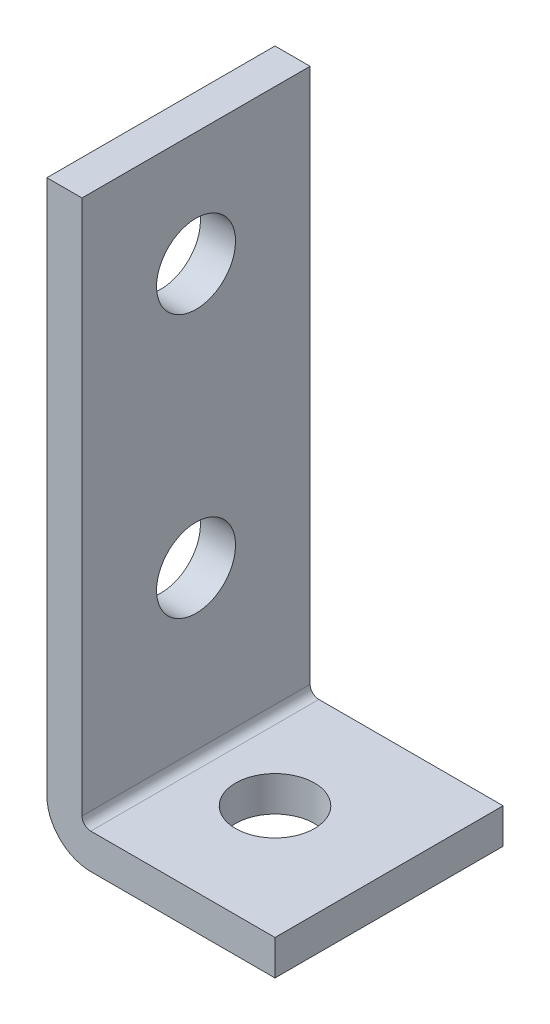
ISO-10303-21;
HEADER;
FILE_DESCRIPTION(('STEP AP214'),'2;1');
FILE_NAME('part.step','',(''),(''),'','','');
FILE_SCHEMA(('AUTOMOTIVE_DESIGN { 1 0 10303 214 1 1 1 1 }'));
ENDSEC;
DATA;
#1=APPLICATION_CONTEXT('core data for automotive mechanical design processes');
#2=APPLICATION_PROTOCOL_DEFINITION('international standard','automotive_design',2000,#1);
#3=PRODUCT_CONTEXT('',#1,'mechanical');
#4=PRODUCT('Part','Part','',(#3));
#5=PRODUCT_RELATED_PRODUCT_CATEGORY('part','',(#4));
#6=PRODUCT_DEFINITION_FORMATION('','',#4);
#7=PRODUCT_DEFINITION_CONTEXT('part definition',#1,'design');
#8=PRODUCT_DEFINITION('design','',#6,#7);
#9=PRODUCT_DEFINITION_SHAPE('','',#8);
#10=(LENGTH_UNIT() NAMED_UNIT(*) SI_UNIT(.MILLI.,.METRE.));
#11=(NAMED_UNIT(*) PLANE_ANGLE_UNIT() SI_UNIT($,.RADIAN.));
#12=(NAMED_UNIT(*) SI_UNIT($,.STERADIAN.) SOLID_ANGLE_UNIT());
#13=UNCERTAINTY_MEASURE_WITH_UNIT(LENGTH_MEASURE(1.E-05),#10,'distance_accuracy_value','');
#14=(GEOMETRIC_REPRESENTATION_CONTEXT(3) GLOBAL_UNCERTAINTY_ASSIGNED_CONTEXT((#13)) GLOBAL_UNIT_ASSIGNED_CONTEXT((#10,
#11,#12)) REPRESENTATION_CONTEXT('',''));
#15=CARTESIAN_POINT('',(0.,0.,0.));
#16=DIRECTION('',(0.,0.,1.));
#17=DIRECTION('',(1.,0.,0.));
#18=AXIS2_PLACEMENT_3D('',#15,#16,#17);
#19=CARTESIAN_POINT('',(7.93750000000001,0.,20.6375));
#20=DIRECTION('',(0.,1.,0.));
#21=DIRECTION('',(0.,0.,1.));
#22=AXIS2_PLACEMENT_3D('',#19,#20,#21);
#23=PLANE('',#22);
#24=CARTESIAN_POINT('',(20.6375,0.,0.));
#25=DIRECTION('',(0.,1.,0.));
#26=DIRECTION('',(0.,0.,1.));
#27=AXIS2_PLACEMENT_3D('',#24,#25,#26);
#28=CIRCLE('',#27,7.14375);
#29=CARTESIAN_POINT('',(20.6375,0.,7.14375));
#30=VERTEX_POINT('',#29);
#31=EDGE_CURVE('E133',#30,#30,#28,.T.);
#32=ORIENTED_EDGE('',*,*,#31,.T.);
#33=EDGE_LOOP('',(#32));
#34=FACE_BOUND('',#33,.T.);
#35=DIRECTION('',(1.,0.,0.));
#36=VECTOR('',#35,1.);
#37=CARTESIAN_POINT('',(7.93750000000001,0.,-20.6375));
#38=LINE('',#37,#36);
#39=CARTESIAN_POINT('',(7.93750000000001,0.,-20.6375));
#40=VERTEX_POINT('',#39);
#41=CARTESIAN_POINT('',(41.275,0.,-20.6375));
#42=VERTEX_POINT('',#41);
#43=EDGE_CURVE('E129',#40,#42,#38,.T.);
#44=ORIENTED_EDGE('',*,*,#43,.T.);
#45=DIRECTION('',(0.,0.,-1.));
#46=VECTOR('',#45,1.);
#47=CARTESIAN_POINT('',(41.275,0.,20.6375));
#48=LINE('',#47,#46);
#49=CARTESIAN_POINT('',(41.275,0.,20.6375));
#50=VERTEX_POINT('',#49);
#51=EDGE_CURVE('E11',#50,#42,#48,.T.);
#52=ORIENTED_EDGE('',*,*,#51,.F.);
#53=DIRECTION('',(1.,0.,0.));
#54=VECTOR('',#53,1.);
#55=CARTESIAN_POINT('',(7.93750000000001,0.,20.6375));
#56=LINE('',#55,#54);
#57=CARTESIAN_POINT('',(7.93750000000001,0.,20.6375));
#58=VERTEX_POINT('',#57);
#59=EDGE_CURVE('E87',#58,#50,#56,.T.);
#60=ORIENTED_EDGE('',*,*,#59,.F.);
#61=DIRECTION('',(0.,0.,-1.));
#62=VECTOR('',#61,1.);
#63=CARTESIAN_POINT('',(7.93750000000001,0.,20.6375));
#64=LINE('',#63,#62);
#65=EDGE_CURVE('E128',#58,#40,#64,.T.);
#66=ORIENTED_EDGE('',*,*,#65,.T.);
#67=EDGE_LOOP('',(#44,#52,#60,#66));
#68=FACE_BOUND('',#67,.T.);
#69=ADVANCED_FACE('F32',(#34,#68),#23,.F.);
#70=CARTESIAN_POINT('',(41.275,6.35,20.6375));
#71=DIRECTION('',(1.,0.,0.));
#72=DIRECTION('',(0.,0.,-1.));
#73=AXIS2_PLACEMENT_3D('',#70,#71,#72);
#74=PLANE('',#73);
#75=DIRECTION('',(0.,-1.,0.));
#76=VECTOR('',#75,1.);
#77=CARTESIAN_POINT('',(41.275,6.35,-20.6375));
#78=LINE('',#77,#76);
#79=CARTESIAN_POINT('',(41.275,6.35,-20.6375));
#80=VERTEX_POINT('',#79);
#81=EDGE_CURVE('E132',#80,#42,#78,.T.);
#82=ORIENTED_EDGE('',*,*,#81,.F.);
#83=DIRECTION('',(0.,0.,-1.));
#84=VECTOR('',#83,1.);
#85=CARTESIAN_POINT('',(41.275,6.35,20.6375));
#86=LINE('',#85,#84);
#87=CARTESIAN_POINT('',(41.275,6.35,20.6375));
#88=VERTEX_POINT('',#87);
#89=EDGE_CURVE('E40',#88,#80,#86,.T.);
#90=ORIENTED_EDGE('',*,*,#89,.F.);
#91=DIRECTION('',(0.,-1.,0.));
#92=VECTOR('',#91,1.);
#93=CARTESIAN_POINT('',(41.275,6.35,20.6375));
#94=LINE('',#93,#92);
#95=EDGE_CURVE('E172',#88,#50,#94,.T.);
#96=ORIENTED_EDGE('',*,*,#95,.T.);
#97=ORIENTED_EDGE('',*,*,#51,.T.);
#98=EDGE_LOOP('',(#82,#90,#96,#97));
#99=FACE_BOUND('',#98,.T.);
#100=ADVANCED_FACE('F163',(#99),#74,.T.);
#101=CARTESIAN_POINT('',(7.93750000000001,6.35,20.6375));
#102=DIRECTION('',(0.,1.,0.));
#103=DIRECTION('',(0.,0.,1.));
#104=AXIS2_PLACEMENT_3D('',#101,#102,#103);
#105=PLANE('',#104);
#106=CARTESIAN_POINT('',(20.6375,6.35,0.));
#107=DIRECTION('',(0.,1.,0.));
#108=DIRECTION('',(0.,0.,1.));
#109=AXIS2_PLACEMENT_3D('',#106,#107,#108);
#110=CIRCLE('',#109,7.14375);
#111=CARTESIAN_POINT('',(20.6375,6.35,7.14375));
#112=VERTEX_POINT('',#111);
#113=EDGE_CURVE('E177',#112,#112,#110,.T.);
#114=ORIENTED_EDGE('',*,*,#113,.F.);
#115=EDGE_LOOP('',(#114));
#116=FACE_BOUND('',#115,.T.);
#117=DIRECTION('',(1.,0.,0.));
#118=VECTOR('',#117,1.);
#119=CARTESIAN_POINT('',(7.93750000000001,6.35,-20.6375));
#120=LINE('',#119,#118);
#121=CARTESIAN_POINT('',(7.93750000000001,6.35,-20.6375));
#122=VERTEX_POINT('',#121);
#123=EDGE_CURVE('E136',#122,#80,#120,.T.);
#124=ORIENTED_EDGE('',*,*,#123,.F.);
#125=DIRECTION('',(0.,0.,-1.));
#126=VECTOR('',#125,1.);
#127=CARTESIAN_POINT('',(7.93750000000001,6.35,20.6375));
#128=LINE('',#127,#126);
#129=CARTESIAN_POINT('',(7.93750000000001,6.35,20.6375));
#130=VERTEX_POINT('',#129);
#131=EDGE_CURVE('E153',#130,#122,#128,.T.);
#132=ORIENTED_EDGE('',*,*,#131,.F.);
#133=DIRECTION('',(1.,0.,0.));
#134=VECTOR('',#133,1.);
#135=CARTESIAN_POINT('',(7.93750000000001,6.35,20.6375));
#136=LINE('',#135,#134);
#137=EDGE_CURVE('E160',#130,#88,#136,.T.);
#138=ORIENTED_EDGE('',*,*,#137,.T.);
#139=ORIENTED_EDGE('',*,*,#89,.T.);
#140=EDGE_LOOP('',(#124,#132,#138,#139));
#141=FACE_BOUND('',#140,.T.);
#142=ADVANCED_FACE('F158',(#116,#141),#105,.T.);
#143=CARTESIAN_POINT('',(7.93750000000001,7.9375,20.6375));
#144=DIRECTION('',(0.,0.,-1.));
#145=DIRECTION('',(-1.,0.,0.));
#146=AXIS2_PLACEMENT_3D('',#143,#144,#145);
#147=CYLINDRICAL_SURFACE('',#146,1.5875);
#148=CARTESIAN_POINT('',(7.93750000000001,7.9375,-20.6375));
#149=DIRECTION('',(0.,0.,1.));
#150=DIRECTION('',(1.,0.,0.));
#151=AXIS2_PLACEMENT_3D('',#148,#149,#150);
#152=CIRCLE('',#151,1.5875);
#153=CARTESIAN_POINT('',(6.35000000000001,7.9375,-20.6375));
#154=VERTEX_POINT('',#153);
#155=EDGE_CURVE('E139',#154,#122,#152,.T.);
#156=ORIENTED_EDGE('',*,*,#155,.F.);
#157=DIRECTION('',(0.,0.,-1.));
#158=VECTOR('',#157,1.);
#159=CARTESIAN_POINT('',(6.35000000000001,7.9375,20.6375));
#160=LINE('',#159,#158);
#161=CARTESIAN_POINT('',(6.35000000000001,7.9375,20.6375));
#162=VERTEX_POINT('',#161);
#163=EDGE_CURVE('E151',#162,#154,#160,.T.);
#164=ORIENTED_EDGE('',*,*,#163,.F.);
#165=CARTESIAN_POINT('',(7.93750000000001,7.9375,20.6375));
#166=DIRECTION('',(0.,0.,1.));
#167=DIRECTION('',(1.,0.,0.));
#168=AXIS2_PLACEMENT_3D('',#165,#166,#167);
#169=CIRCLE('',#168,1.5875);
#170=EDGE_CURVE('E123',#162,#130,#169,.T.);
#171=ORIENTED_EDGE('',*,*,#170,.T.);
#172=ORIENTED_EDGE('',*,*,#131,.T.);
#173=EDGE_LOOP('',(#156,#164,#171,#172));
#174=FACE_BOUND('',#173,.T.);
#175=ADVANCED_FACE('F170',(#174),#147,.F.);
#176=CARTESIAN_POINT('',(6.35,104.775,20.6375));
#177=DIRECTION('',(1.,0.,0.));
#178=DIRECTION('',(0.,1.,0.));
#179=AXIS2_PLACEMENT_3D('',#176,#177,#178);
#180=PLANE('',#179);
#181=CARTESIAN_POINT('',(6.35000000000001,36.5125,0.));
#182=DIRECTION('',(1.,0.,0.));
#183=DIRECTION('',(0.,1.,0.));
#184=AXIS2_PLACEMENT_3D('',#181,#182,#183);
#185=CIRCLE('',#184,7.14375);
#186=CARTESIAN_POINT('',(6.35000000000001,43.65625,0.));
#187=VERTEX_POINT('',#186);
#188=EDGE_CURVE('E189',#187,#187,#185,.T.);
#189=ORIENTED_EDGE('',*,*,#188,.F.);
#190=EDGE_LOOP('',(#189));
#191=FACE_BOUND('',#190,.T.);
#192=CARTESIAN_POINT('',(6.35,84.1375,0.));
#193=DIRECTION('',(1.,0.,0.));
#194=DIRECTION('',(0.,1.,0.));
#195=AXIS2_PLACEMENT_3D('',#192,#193,#194);
#196=CIRCLE('',#195,7.14375000000001);
#197=CARTESIAN_POINT('',(6.35,91.28125,0.));
#198=VERTEX_POINT('',#197);
#199=EDGE_CURVE('E183',#198,#198,#196,.T.);
#200=ORIENTED_EDGE('',*,*,#199,.F.);
#201=EDGE_LOOP('',(#200));
#202=FACE_BOUND('',#201,.T.);
#203=DIRECTION('',(0.,-1.,0.));
#204=VECTOR('',#203,1.);
#205=CARTESIAN_POINT('',(6.35,104.775,-20.6375));
#206=LINE('',#205,#204);
#207=CARTESIAN_POINT('',(6.35,104.775,-20.6375));
#208=VERTEX_POINT('',#207);
#209=EDGE_CURVE('E142',#208,#154,#206,.T.);
#210=ORIENTED_EDGE('',*,*,#209,.F.);
#211=DIRECTION('',(0.,0.,-1.));
#212=VECTOR('',#211,1.);
#213=CARTESIAN_POINT('',(6.35,104.775,20.6375));
#214=LINE('',#213,#212);
#215=CARTESIAN_POINT('',(6.35,104.775,20.6375));
#216=VERTEX_POINT('',#215);
#217=EDGE_CURVE('E111',#216,#208,#214,.T.);
#218=ORIENTED_EDGE('',*,*,#217,.F.);
#219=DIRECTION('',(0.,-1.,0.));
#220=VECTOR('',#219,1.);
#221=CARTESIAN_POINT('',(6.35,104.775,20.6375));
#222=LINE('',#221,#220);
#223=EDGE_CURVE('E121',#216,#162,#222,.T.);
#224=ORIENTED_EDGE('',*,*,#223,.T.);
#225=ORIENTED_EDGE('',*,*,#163,.T.);
#226=EDGE_LOOP('',(#210,#218,#224,#225));
#227=FACE_BOUND('',#226,.T.);
#228=ADVANCED_FACE('F204',(#191,#202,#227),#180,.T.);
#229=CARTESIAN_POINT('',(0.,104.775,20.6375));
#230=DIRECTION('',(0.,1.,0.));
#231=DIRECTION('',(0.,0.,1.));
#232=AXIS2_PLACEMENT_3D('',#229,#230,#231);
#233=PLANE('',#232);
#234=DIRECTION('',(1.,0.,0.));
#235=VECTOR('',#234,1.);
#236=CARTESIAN_POINT('',(0.,104.775,-20.6375));
#237=LINE('',#236,#235);
#238=CARTESIAN_POINT('',(0.,104.775,-20.6375));
#239=VERTEX_POINT('',#238);
#240=EDGE_CURVE('E110',#239,#208,#237,.T.);
#241=ORIENTED_EDGE('',*,*,#240,.F.);
#242=DIRECTION('',(0.,0.,-1.));
#243=VECTOR('',#242,1.);
#244=CARTESIAN_POINT('',(0.,104.775,20.6375));
#245=LINE('',#244,#243);
#246=CARTESIAN_POINT('',(0.,104.775,20.6375));
#247=VERTEX_POINT('',#246);
#248=EDGE_CURVE('E104',#247,#239,#245,.T.);
#249=ORIENTED_EDGE('',*,*,#248,.F.);
#250=DIRECTION('',(1.,0.,0.));
#251=VECTOR('',#250,1.);
#252=CARTESIAN_POINT('',(0.,104.775,20.6375));
#253=LINE('',#252,#251);
#254=EDGE_CURVE('E108',#247,#216,#253,.T.);
#255=ORIENTED_EDGE('',*,*,#254,.T.);
#256=ORIENTED_EDGE('',*,*,#217,.T.);
#257=EDGE_LOOP('',(#241,#249,#255,#256));
#258=FACE_BOUND('',#257,.T.);
#259=ADVANCED_FACE('F106',(#258),#233,.T.);
#260=CARTESIAN_POINT('',(0.,104.775,20.6375));
#261=DIRECTION('',(1.,0.,0.));
#262=DIRECTION('',(0.,1.,0.));
#263=AXIS2_PLACEMENT_3D('',#260,#261,#262);
#264=PLANE('',#263);
#265=CARTESIAN_POINT('',(0.,36.5125,0.));
#266=DIRECTION('',(1.,0.,0.));
#267=DIRECTION('',(0.,1.,0.));
#268=AXIS2_PLACEMENT_3D('',#265,#266,#267);
#269=CIRCLE('',#268,7.14375);
#270=CARTESIAN_POINT('',(0.,43.65625,0.));
#271=VERTEX_POINT('',#270);
#272=EDGE_CURVE('E186',#271,#271,#269,.T.);
#273=ORIENTED_EDGE('',*,*,#272,.T.);
#274=EDGE_LOOP('',(#273));
#275=FACE_BOUND('',#274,.T.);
#276=CARTESIAN_POINT('',(0.,84.1375,0.));
#277=DIRECTION('',(1.,0.,0.));
#278=DIRECTION('',(0.,1.,0.));
#279=AXIS2_PLACEMENT_3D('',#276,#277,#278);
#280=CIRCLE('',#279,7.14375000000001);
#281=CARTESIAN_POINT('',(0.,91.28125,0.));
#282=VERTEX_POINT('',#281);
#283=EDGE_CURVE('E180',#282,#282,#280,.T.);
#284=ORIENTED_EDGE('',*,*,#283,.T.);
#285=EDGE_LOOP('',(#284));
#286=FACE_BOUND('',#285,.T.);
#287=DIRECTION('',(0.,-1.,0.));
#288=VECTOR('',#287,1.);
#289=CARTESIAN_POINT('',(0.,104.775,-20.6375));
#290=LINE('',#289,#288);
#291=CARTESIAN_POINT('',(0.,7.9375,-20.6375));
#292=VERTEX_POINT('',#291);
#293=EDGE_CURVE('E75',#239,#292,#290,.T.);
#294=ORIENTED_EDGE('',*,*,#293,.T.);
#295=DIRECTION('',(0.,0.,-1.));
#296=VECTOR('',#295,1.);
#297=CARTESIAN_POINT('',(0.,7.9375,20.6375));
#298=LINE('',#297,#296);
#299=CARTESIAN_POINT('',(0.,7.9375,20.6375));
#300=VERTEX_POINT('',#299);
#301=EDGE_CURVE('E112',#300,#292,#298,.T.);
#302=ORIENTED_EDGE('',*,*,#301,.F.);
#303=DIRECTION('',(0.,-1.,0.));
#304=VECTOR('',#303,1.);
#305=CARTESIAN_POINT('',(0.,104.775,20.6375));
#306=LINE('',#305,#304);
#307=EDGE_CURVE('E114',#247,#300,#306,.T.);
#308=ORIENTED_EDGE('',*,*,#307,.F.);
#309=ORIENTED_EDGE('',*,*,#248,.T.);
#310=EDGE_LOOP('',(#294,#302,#308,#309));
#311=FACE_BOUND('',#310,.T.);
#312=ADVANCED_FACE('F115',(#275,#286,#311),#264,.F.);
#313=CARTESIAN_POINT('',(7.93750000000001,7.9375,20.6375));
#314=DIRECTION('',(0.,0.,-1.));
#315=DIRECTION('',(-1.,0.,0.));
#316=AXIS2_PLACEMENT_3D('',#313,#314,#315);
#317=CYLINDRICAL_SURFACE('',#316,7.9375);
#318=CARTESIAN_POINT('',(7.93750000000001,7.9375,-20.6375));
#319=DIRECTION('',(0.,0.,1.));
#320=DIRECTION('',(1.,0.,0.));
#321=AXIS2_PLACEMENT_3D('',#318,#319,#320);
#322=CIRCLE('',#321,7.9375);
#323=EDGE_CURVE('E81',#292,#40,#322,.T.);
#324=ORIENTED_EDGE('',*,*,#323,.T.);
#325=ORIENTED_EDGE('',*,*,#65,.F.);
#326=CARTESIAN_POINT('',(7.93750000000001,7.9375,20.6375));
#327=DIRECTION('',(0.,0.,1.));
#328=DIRECTION('',(1.,0.,0.));
#329=AXIS2_PLACEMENT_3D('',#326,#327,#328);
#330=CIRCLE('',#329,7.9375);
#331=EDGE_CURVE('E48',#300,#58,#330,.T.);
#332=ORIENTED_EDGE('',*,*,#331,.F.);
#333=ORIENTED_EDGE('',*,*,#301,.T.);
#334=EDGE_LOOP('',(#324,#325,#332,#333));
#335=FACE_BOUND('',#334,.T.);
#336=ADVANCED_FACE('F211',(#335),#317,.T.);
#337=CARTESIAN_POINT('',(7.93750000000001,7.9375,20.6375));
#338=DIRECTION('',(0.,0.,1.));
#339=DIRECTION('',(1.,0.,0.));
#340=AXIS2_PLACEMENT_3D('',#337,#338,#339);
#341=PLANE('',#340);
#342=ORIENTED_EDGE('',*,*,#59,.T.);
#343=ORIENTED_EDGE('',*,*,#95,.F.);
#344=ORIENTED_EDGE('',*,*,#137,.F.);
#345=ORIENTED_EDGE('',*,*,#170,.F.);
#346=ORIENTED_EDGE('',*,*,#223,.F.);
#347=ORIENTED_EDGE('',*,*,#254,.F.);
#348=ORIENTED_EDGE('',*,*,#307,.T.);
#349=ORIENTED_EDGE('',*,*,#331,.T.);
#350=EDGE_LOOP('',(#342,#343,#344,#345,#346,#347,#348,#349));
#351=FACE_BOUND('',#350,.T.);
#352=ADVANCED_FACE('F118',(#351),#341,.T.);
#353=CARTESIAN_POINT('',(7.93750000000001,7.9375,-20.6375));
#354=DIRECTION('',(0.,0.,1.));
#355=DIRECTION('',(1.,0.,0.));
#356=AXIS2_PLACEMENT_3D('',#353,#354,#355);
#357=PLANE('',#356);
#358=ORIENTED_EDGE('',*,*,#43,.F.);
#359=ORIENTED_EDGE('',*,*,#323,.F.);
#360=ORIENTED_EDGE('',*,*,#293,.F.);
#361=ORIENTED_EDGE('',*,*,#240,.T.);
#362=ORIENTED_EDGE('',*,*,#209,.T.);
#363=ORIENTED_EDGE('',*,*,#155,.T.);
#364=ORIENTED_EDGE('',*,*,#123,.T.);
#365=ORIENTED_EDGE('',*,*,#81,.T.);
#366=EDGE_LOOP('',(#358,#359,#360,#361,#362,#363,#364,#365));
#367=FACE_BOUND('',#366,.T.);
#368=ADVANCED_FACE('F166',(#367),#357,.F.);
#369=CARTESIAN_POINT('',(20.6375,0.,0.));
#370=DIRECTION('',(0.,1.,0.));
#371=DIRECTION('',(0.,0.,1.));
#372=AXIS2_PLACEMENT_3D('',#369,#370,#371);
#373=CYLINDRICAL_SURFACE('',#372,7.14375);
#374=ORIENTED_EDGE('',*,*,#31,.F.);
#375=EDGE_LOOP('',(#374));
#376=FACE_BOUND('',#375,.T.);
#377=ORIENTED_EDGE('',*,*,#113,.T.);
#378=EDGE_LOOP('',(#377));
#379=FACE_BOUND('',#378,.T.);
#380=ADVANCED_FACE('F228',(#376,#379),#373,.F.);
#381=CARTESIAN_POINT('',(0.,84.1375,0.));
#382=DIRECTION('',(1.,0.,0.));
#383=DIRECTION('',(0.,1.,0.));
#384=AXIS2_PLACEMENT_3D('',#381,#382,#383);
#385=CYLINDRICAL_SURFACE('',#384,7.14375000000001);
#386=CARTESIAN_POINT('',(0.,91.28125,0.));
#387=CARTESIAN_POINT('',(0.0661458333333206,91.28125,0.));
#388=CARTESIAN_POINT('',(0.132291666666654,91.28125,0.));
#389=CARTESIAN_POINT('',(0.264583333333321,91.28125,0.));
#390=CARTESIAN_POINT('',(0.330729166666654,91.28125,0.));
#391=CARTESIAN_POINT('',(0.463020833333321,91.28125,0.));
#392=CARTESIAN_POINT('',(0.529166666666655,91.28125,0.));
#393=CARTESIAN_POINT('',(0.661458333333322,91.28125,0.));
#394=CARTESIAN_POINT('',(0.727604166666655,91.28125,0.));
#395=CARTESIAN_POINT('',(0.859895833333322,91.28125,0.));
#396=CARTESIAN_POINT('',(0.926041666666656,91.28125,0.));
#397=CARTESIAN_POINT('',(1.05833333333332,91.28125,0.));
#398=CARTESIAN_POINT('',(1.12447916666666,91.28125,0.));
#399=CARTESIAN_POINT('',(1.25677083333332,91.28125,0.));
#400=CARTESIAN_POINT('',(1.32291666666666,91.28125,0.));
#401=CARTESIAN_POINT('',(1.45520833333332,91.28125,0.));
#402=CARTESIAN_POINT('',(1.52135416666666,91.28125,0.));
#403=CARTESIAN_POINT('',(1.65364583333332,91.28125,0.));
#404=CARTESIAN_POINT('',(1.71979166666666,91.28125,0.));
#405=CARTESIAN_POINT('',(1.85208333333332,91.28125,0.));
#406=CARTESIAN_POINT('',(1.91822916666666,91.28125,0.));
#407=CARTESIAN_POINT('',(2.05052083333332,91.28125,0.));
#408=CARTESIAN_POINT('',(2.11666666666666,91.28125,0.));
#409=CARTESIAN_POINT('',(2.24895833333332,91.28125,0.));
#410=CARTESIAN_POINT('',(2.31510416666666,91.28125,0.));
#411=CARTESIAN_POINT('',(2.44739583333333,91.28125,0.));
#412=CARTESIAN_POINT('',(2.51354166666666,91.28125,0.));
#413=CARTESIAN_POINT('',(2.64583333333333,91.28125,0.));
#414=CARTESIAN_POINT('',(2.71197916666666,91.28125,0.));
#415=CARTESIAN_POINT('',(2.84427083333333,91.28125,0.));
#416=CARTESIAN_POINT('',(2.91041666666666,91.28125,0.));
#417=CARTESIAN_POINT('',(3.04270833333333,91.28125,0.));
#418=CARTESIAN_POINT('',(3.10885416666666,91.28125,0.));
#419=CARTESIAN_POINT('',(3.24114583333333,91.28125,0.));
#420=CARTESIAN_POINT('',(3.30729166666666,91.28125,0.));
#421=CARTESIAN_POINT('',(3.43958333333333,91.28125,0.));
#422=CARTESIAN_POINT('',(3.50572916666666,91.28125,0.));
#423=CARTESIAN_POINT('',(3.63802083333333,91.28125,0.));
#424=CARTESIAN_POINT('',(3.70416666666666,91.28125,0.));
#425=CARTESIAN_POINT('',(3.83645833333333,91.28125,0.));
#426=CARTESIAN_POINT('',(3.90260416666666,91.28125,0.));
#427=CARTESIAN_POINT('',(4.03489583333333,91.28125,0.));
#428=CARTESIAN_POINT('',(4.10104166666666,91.28125,0.));
#429=CARTESIAN_POINT('',(4.23333333333333,91.28125,0.));
#430=CARTESIAN_POINT('',(4.29947916666666,91.28125,0.));
#431=CARTESIAN_POINT('',(4.43177083333333,91.28125,0.));
#432=CARTESIAN_POINT('',(4.49791666666666,91.28125,0.));
#433=CARTESIAN_POINT('',(4.63020833333333,91.28125,0.));
#434=CARTESIAN_POINT('',(4.69635416666666,91.28125,0.));
#435=CARTESIAN_POINT('',(4.82864583333333,91.28125,0.));
#436=CARTESIAN_POINT('',(4.89479166666666,91.28125,0.));
#437=CARTESIAN_POINT('',(5.02708333333333,91.28125,0.));
#438=CARTESIAN_POINT('',(5.09322916666667,91.28125,0.));
#439=CARTESIAN_POINT('',(5.22552083333333,91.28125,0.));
#440=CARTESIAN_POINT('',(5.29166666666667,91.28125,0.));
#441=CARTESIAN_POINT('',(5.42395833333333,91.28125,0.));
#442=CARTESIAN_POINT('',(5.49010416666667,91.28125,0.));
#443=CARTESIAN_POINT('',(5.62239583333333,91.28125,0.));
#444=CARTESIAN_POINT('',(5.68854166666667,91.28125,0.));
#445=CARTESIAN_POINT('',(5.82083333333333,91.28125,0.));
#446=CARTESIAN_POINT('',(5.88697916666667,91.28125,0.));
#447=CARTESIAN_POINT('',(6.01927083333333,91.28125,0.));
#448=CARTESIAN_POINT('',(6.08541666666667,91.28125,0.));
#449=CARTESIAN_POINT('',(6.21770833333333,91.28125,0.));
#450=CARTESIAN_POINT('',(6.28385416666667,91.28125,0.));
#451=CARTESIAN_POINT('',(6.35,91.28125,0.));
#452=B_SPLINE_CURVE_WITH_KNOTS('',3,(#386,#387,#388,#389,#390,#391,#392,#393,#394,#395,#396,
#397,#398,#399,#400,#401,#402,#403,#404,#405,#406,#407,#408,#409,#410,#411,#412,#413,#414,#415,
#416,#417,#418,#419,#420,#421,#422,#423,#424,#425,#426,#427,#428,#429,#430,#431,#432,#433,#434,
#435,#436,#437,#438,#439,#440,#441,#442,#443,#444,#445,#446,#447,#448,#449,#450,#451),
.UNSPECIFIED.,.F.,.F.,(4,2,2,2,2,2,2,2,2,2,2,2,2,2,2,2,2,2,2,2,2,2,2,2,2,2,2,2,2,2,2,2,4),(0.,
0.1984375,0.396875000000001,0.595312500000001,0.793750000000002,0.992187500000002,1.190625,
1.3890625,1.5875,1.7859375,1.984375,2.1828125,2.38125000000001,2.57968750000001,
2.77812500000001,2.97656250000001,3.17500000000001,3.37343750000001,3.57187500000001,
3.77031250000001,3.96875000000001,4.16718750000001,4.36562500000001,4.56406250000001,
4.76250000000001,4.96093750000001,5.15937500000001,5.35781250000001,5.55625000000001,
5.75468750000001,5.95312500000001,6.15156250000001,6.35000000000001),.UNSPECIFIED.);
#453=EDGE_CURVE('BSEAM200',#282,#198,#452,.T.);
#454=ORIENTED_EDGE('',*,*,#283,.F.);
#455=ORIENTED_EDGE('',*,*,#199,.T.);
#456=ORIENTED_EDGE('',*,*,#453,.T.);
#457=ORIENTED_EDGE('',*,*,#453,.F.);
#458=EDGE_LOOP('',(#454,#456,#455,#457));
#459=FACE_BOUND('',#458,.T.);
#460=ADVANCED_FACE('F200',(#459),#385,.F.);
#461=CARTESIAN_POINT('',(0.,36.5125,0.));
#462=DIRECTION('',(1.,0.,0.));
#463=DIRECTION('',(0.,1.,0.));
#464=AXIS2_PLACEMENT_3D('',#461,#462,#463);
#465=CYLINDRICAL_SURFACE('',#464,7.14375);
#466=CARTESIAN_POINT('',(0.,43.65625,0.));
#467=CARTESIAN_POINT('',(0.0661458333333266,43.65625,0.));
#468=CARTESIAN_POINT('',(0.13229166666666,43.65625,0.));
#469=CARTESIAN_POINT('',(0.264583333333327,43.65625,0.));
#470=CARTESIAN_POINT('',(0.33072916666666,43.65625,0.));
#471=CARTESIAN_POINT('',(0.463020833333327,43.65625,0.));
#472=CARTESIAN_POINT('',(0.529166666666661,43.65625,0.));
#473=CARTESIAN_POINT('',(0.661458333333328,43.65625,0.));
#474=CARTESIAN_POINT('',(0.727604166666661,43.65625,0.));
#475=CARTESIAN_POINT('',(0.859895833333328,43.65625,0.));
#476=CARTESIAN_POINT('',(0.926041666666662,43.65625,0.));
#477=CARTESIAN_POINT('',(1.05833333333333,43.65625,0.));
#478=CARTESIAN_POINT('',(1.12447916666666,43.65625,0.));
#479=CARTESIAN_POINT('',(1.25677083333333,43.65625,0.));
#480=CARTESIAN_POINT('',(1.32291666666666,43.65625,0.));
#481=CARTESIAN_POINT('',(1.45520833333333,43.65625,0.));
#482=CARTESIAN_POINT('',(1.52135416666666,43.65625,0.));
#483=CARTESIAN_POINT('',(1.65364583333333,43.65625,0.));
#484=CARTESIAN_POINT('',(1.71979166666666,43.65625,0.));
#485=CARTESIAN_POINT('',(1.85208333333333,43.65625,0.));
#486=CARTESIAN_POINT('',(1.91822916666666,43.65625,0.));
#487=CARTESIAN_POINT('',(2.05052083333333,43.65625,0.));
#488=CARTESIAN_POINT('',(2.11666666666666,43.65625,0.));
#489=CARTESIAN_POINT('',(2.24895833333333,43.65625,0.));
#490=CARTESIAN_POINT('',(2.31510416666667,43.65625,0.));
#491=CARTESIAN_POINT('',(2.44739583333333,43.65625,0.));
#492=CARTESIAN_POINT('',(2.51354166666667,43.65625,0.));
#493=CARTESIAN_POINT('',(2.64583333333333,43.65625,0.));
#494=CARTESIAN_POINT('',(2.71197916666667,43.65625,0.));
#495=CARTESIAN_POINT('',(2.84427083333333,43.65625,0.));
#496=CARTESIAN_POINT('',(2.91041666666667,43.65625,0.));
#497=CARTESIAN_POINT('',(3.04270833333333,43.65625,0.));
#498=CARTESIAN_POINT('',(3.10885416666667,43.65625,0.));
#499=CARTESIAN_POINT('',(3.24114583333333,43.65625,0.));
#500=CARTESIAN_POINT('',(3.30729166666667,43.65625,0.));
#501=CARTESIAN_POINT('',(3.43958333333333,43.65625,0.));
#502=CARTESIAN_POINT('',(3.50572916666667,43.65625,0.));
#503=CARTESIAN_POINT('',(3.63802083333333,43.65625,0.));
#504=CARTESIAN_POINT('',(3.70416666666667,43.65625,0.));
#505=CARTESIAN_POINT('',(3.83645833333334,43.65625,0.));
#506=CARTESIAN_POINT('',(3.90260416666667,43.65625,0.));
#507=CARTESIAN_POINT('',(4.03489583333334,43.65625,0.));
#508=CARTESIAN_POINT('',(4.10104166666667,43.65625,0.));
#509=CARTESIAN_POINT('',(4.23333333333334,43.65625,0.));
#510=CARTESIAN_POINT('',(4.29947916666667,43.65625,0.));
#511=CARTESIAN_POINT('',(4.43177083333334,43.65625,0.));
#512=CARTESIAN_POINT('',(4.49791666666667,43.65625,0.));
#513=CARTESIAN_POINT('',(4.63020833333334,43.65625,0.));
#514=CARTESIAN_POINT('',(4.69635416666667,43.65625,0.));
#515=CARTESIAN_POINT('',(4.82864583333334,43.65625,0.));
#516=CARTESIAN_POINT('',(4.89479166666667,43.65625,0.));
#517=CARTESIAN_POINT('',(5.02708333333334,43.65625,0.));
#518=CARTESIAN_POINT('',(5.09322916666667,43.65625,0.));
#519=CARTESIAN_POINT('',(5.22552083333334,43.65625,0.));
#520=CARTESIAN_POINT('',(5.29166666666667,43.65625,0.));
#521=CARTESIAN_POINT('',(5.42395833333334,43.65625,0.));
#522=CARTESIAN_POINT('',(5.49010416666667,43.65625,0.));
#523=CARTESIAN_POINT('',(5.62239583333334,43.65625,0.));
#524=CARTESIAN_POINT('',(5.68854166666667,43.65625,0.));
#525=CARTESIAN_POINT('',(5.82083333333334,43.65625,0.));
#526=CARTESIAN_POINT('',(5.88697916666667,43.65625,0.));
#527=CARTESIAN_POINT('',(6.01927083333334,43.65625,0.));
#528=CARTESIAN_POINT('',(6.08541666666667,43.65625,0.));
#529=CARTESIAN_POINT('',(6.21770833333334,43.65625,0.));
#530=CARTESIAN_POINT('',(6.28385416666667,43.65625,0.));
#531=CARTESIAN_POINT('',(6.35000000000001,43.65625,0.));
#532=B_SPLINE_CURVE_WITH_KNOTS('',3,(#466,#467,#468,#469,#470,#471,#472,#473,#474,#475,#476,
#477,#478,#479,#480,#481,#482,#483,#484,#485,#486,#487,#488,#489,#490,#491,#492,#493,#494,#495,
#496,#497,#498,#499,#500,#501,#502,#503,#504,#505,#506,#507,#508,#509,#510,#511,#512,#513,#514,
#515,#516,#517,#518,#519,#520,#521,#522,#523,#524,#525,#526,#527,#528,#529,#530,#531),
.UNSPECIFIED.,.F.,.F.,(4,2,2,2,2,2,2,2,2,2,2,2,2,2,2,2,2,2,2,2,2,2,2,2,2,2,2,2,2,2,2,2,4),(0.,
0.1984375,0.396875000000001,0.595312500000001,0.793750000000002,0.992187500000002,1.190625,
1.3890625,1.5875,1.7859375,1.984375,2.1828125,2.38125000000001,2.57968750000001,
2.77812500000001,2.97656250000001,3.17500000000001,3.37343750000001,3.57187500000001,
3.77031250000001,3.96875000000001,4.16718750000001,4.36562500000001,4.56406250000001,
4.76250000000001,4.96093750000001,5.15937500000001,5.35781250000001,5.55625000000001,
5.75468750000001,5.95312500000001,6.15156250000001,6.35000000000001),.UNSPECIFIED.);
#533=EDGE_CURVE('BSEAM197',#271,#187,#532,.T.);
#534=ORIENTED_EDGE('',*,*,#272,.F.);
#535=ORIENTED_EDGE('',*,*,#188,.T.);
#536=ORIENTED_EDGE('',*,*,#533,.T.);
#537=ORIENTED_EDGE('',*,*,#533,.F.);
#538=EDGE_LOOP('',(#534,#536,#535,#537));
#539=FACE_BOUND('',#538,.T.);
#540=ADVANCED_FACE('F197',(#539),#465,.F.);
#541=CLOSED_SHELL('',(#69,#100,#142,#175,#228,#259,#312,#336,#352,#368,#380,#460,#540));
#542=MANIFOLD_SOLID_BREP('B2',#541);
#543=ADVANCED_BREP_SHAPE_REPRESENTATION('',(#18,#542),#14);
#544=SHAPE_DEFINITION_REPRESENTATION(#9,#543);
ENDSEC;
END-ISO-10303-21;
